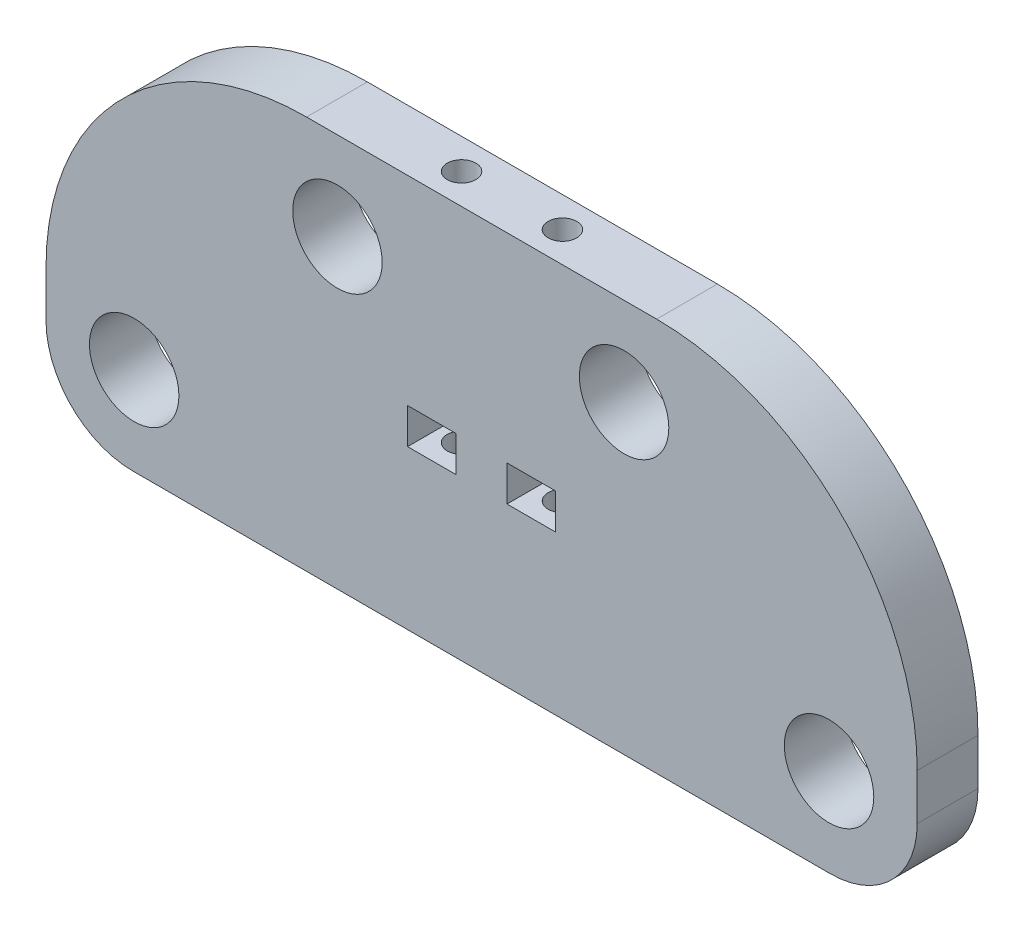
ISO-10303-21;
HEADER;
FILE_DESCRIPTION(('STEP AP214'),'2;1');
FILE_NAME('part.step','',(''),(''),'','','');
FILE_SCHEMA(('AUTOMOTIVE_DESIGN { 1 0 10303 214 1 1 1 1 }'));
ENDSEC;
DATA;
#1=APPLICATION_CONTEXT('core data for automotive mechanical design processes');
#2=APPLICATION_PROTOCOL_DEFINITION('international standard','automotive_design',2000,#1);
#3=PRODUCT_CONTEXT('',#1,'mechanical');
#4=PRODUCT('Part','Part','',(#3));
#5=PRODUCT_RELATED_PRODUCT_CATEGORY('part','',(#4));
#6=PRODUCT_DEFINITION_FORMATION('','',#4);
#7=PRODUCT_DEFINITION_CONTEXT('part definition',#1,'design');
#8=PRODUCT_DEFINITION('design','',#6,#7);
#9=PRODUCT_DEFINITION_SHAPE('','',#8);
#10=(LENGTH_UNIT() NAMED_UNIT(*) SI_UNIT(.MILLI.,.METRE.));
#11=(NAMED_UNIT(*) PLANE_ANGLE_UNIT() SI_UNIT($,.RADIAN.));
#12=(NAMED_UNIT(*) SI_UNIT($,.STERADIAN.) SOLID_ANGLE_UNIT());
#13=UNCERTAINTY_MEASURE_WITH_UNIT(LENGTH_MEASURE(1.E-05),#10,'distance_accuracy_value','');
#14=(GEOMETRIC_REPRESENTATION_CONTEXT(3) GLOBAL_UNCERTAINTY_ASSIGNED_CONTEXT((#13)) GLOBAL_UNIT_ASSIGNED_CONTEXT((#10,
#11,#12)) REPRESENTATION_CONTEXT('',''));
#15=CARTESIAN_POINT('',(0.,0.,0.));
#16=DIRECTION('',(0.,0.,1.));
#17=DIRECTION('',(1.,0.,0.));
#18=AXIS2_PLACEMENT_3D('',#15,#16,#17);
#19=CARTESIAN_POINT('',(0.,-9.2411325614042,7.));
#20=DIRECTION('',(0.,-1.,0.));
#21=DIRECTION('',(0.,0.,-1.));
#22=AXIS2_PLACEMENT_3D('',#19,#20,#21);
#23=PLANE('',#22);
#24=CARTESIAN_POINT('',(-5.72260181073988,-9.2411325614042,3.5));
#25=DIRECTION('',(0.,-1.,0.));
#26=DIRECTION('',(0.,0.,-1.));
#27=AXIS2_PLACEMENT_3D('',#24,#25,#26);
#28=CIRCLE('',#27,1.65);
#29=CARTESIAN_POINT('',(-5.72260181073988,-9.2411325614042,1.85));
#30=VERTEX_POINT('',#29);
#31=EDGE_CURVE('E410',#30,#30,#28,.T.);
#32=ORIENTED_EDGE('',*,*,#31,.F.);
#33=EDGE_LOOP('',(#32));
#34=FACE_BOUND('',#33,.T.);
#35=DIRECTION('',(-1.,0.,0.));
#36=VECTOR('',#35,1.);
#37=CARTESIAN_POINT('',(0.,-9.2411325614042,0.));
#38=LINE('',#37,#36);
#39=CARTESIAN_POINT('',(-2.83559601567761,-9.2411325614042,0.));
#40=VERTEX_POINT('',#39);
#41=CARTESIAN_POINT('',(-8.43559601567761,-9.2411325614042,0.));
#42=VERTEX_POINT('',#41);
#43=EDGE_CURVE('E263',#40,#42,#38,.T.);
#44=ORIENTED_EDGE('',*,*,#43,.F.);
#45=DIRECTION('',(0.,0.,-1.));
#46=VECTOR('',#45,1.);
#47=CARTESIAN_POINT('',(-2.83559601567761,-9.2411325614042,7.));
#48=LINE('',#47,#46);
#49=CARTESIAN_POINT('',(-2.83559601567761,-9.2411325614042,7.));
#50=VERTEX_POINT('',#49);
#51=EDGE_CURVE('E192',#50,#40,#48,.T.);
#52=ORIENTED_EDGE('',*,*,#51,.F.);
#53=DIRECTION('',(-1.,0.,0.));
#54=VECTOR('',#53,1.);
#55=CARTESIAN_POINT('',(0.,-9.2411325614042,7.));
#56=LINE('',#55,#54);
#57=CARTESIAN_POINT('',(-8.43559601567761,-9.2411325614042,7.));
#58=VERTEX_POINT('',#57);
#59=EDGE_CURVE('E392',#50,#58,#56,.T.);
#60=ORIENTED_EDGE('',*,*,#59,.T.);
#61=DIRECTION('',(0.,0.,-1.));
#62=VECTOR('',#61,1.);
#63=CARTESIAN_POINT('',(-8.43559601567761,-9.2411325614042,7.));
#64=LINE('',#63,#62);
#65=EDGE_CURVE('E180',#58,#42,#64,.T.);
#66=ORIENTED_EDGE('',*,*,#65,.T.);
#67=EDGE_LOOP('',(#44,#52,#60,#66));
#68=FACE_BOUND('',#67,.T.);
#69=ADVANCED_FACE('F40',(#34,#68),#23,.T.);
#70=CARTESIAN_POINT('',(-2.8355960156776,0.,7.));
#71=DIRECTION('',(1.,0.,0.));
#72=DIRECTION('',(0.,1.,0.));
#73=AXIS2_PLACEMENT_3D('',#70,#71,#72);
#74=PLANE('',#73);
#75=DIRECTION('',(0.,-1.,0.));
#76=VECTOR('',#75,1.);
#77=CARTESIAN_POINT('',(-2.8355960156776,0.,0.));
#78=LINE('',#77,#76);
#79=CARTESIAN_POINT('',(-2.83559601567761,-13.3411325614042,0.));
#80=VERTEX_POINT('',#79);
#81=EDGE_CURVE('E266',#40,#80,#78,.T.);
#82=ORIENTED_EDGE('',*,*,#81,.T.);
#83=DIRECTION('',(0.,0.,-1.));
#84=VECTOR('',#83,1.);
#85=CARTESIAN_POINT('',(-2.83559601567761,-13.3411325614042,7.));
#86=LINE('',#85,#84);
#87=CARTESIAN_POINT('',(-2.83559601567761,-13.3411325614042,7.));
#88=VERTEX_POINT('',#87);
#89=EDGE_CURVE('E283',#88,#80,#86,.T.);
#90=ORIENTED_EDGE('',*,*,#89,.F.);
#91=DIRECTION('',(0.,-1.,0.));
#92=VECTOR('',#91,1.);
#93=CARTESIAN_POINT('',(-2.8355960156776,0.,7.));
#94=LINE('',#93,#92);
#95=EDGE_CURVE('E395',#50,#88,#94,.T.);
#96=ORIENTED_EDGE('',*,*,#95,.F.);
#97=ORIENTED_EDGE('',*,*,#51,.T.);
#98=EDGE_LOOP('',(#82,#90,#96,#97));
#99=FACE_BOUND('',#98,.T.);
#100=ADVANCED_FACE('F325',(#99),#74,.F.);
#101=CARTESIAN_POINT('',(0.,-13.3411325614042,7.));
#102=DIRECTION('',(0.,-1.,0.));
#103=DIRECTION('',(0.,0.,-1.));
#104=AXIS2_PLACEMENT_3D('',#101,#102,#103);
#105=PLANE('',#104);
#106=CARTESIAN_POINT('',(-5.72260181073988,-13.3411325614042,3.5));
#107=DIRECTION('',(0.,-1.,0.));
#108=DIRECTION('',(0.,0.,-1.));
#109=AXIS2_PLACEMENT_3D('',#106,#107,#108);
#110=CIRCLE('',#109,1.65);
#111=CARTESIAN_POINT('',(-5.72260181073988,-13.3411325614042,1.85));
#112=VERTEX_POINT('',#111);
#113=EDGE_CURVE('E418',#112,#112,#110,.T.);
#114=ORIENTED_EDGE('',*,*,#113,.T.);
#115=EDGE_LOOP('',(#114));
#116=FACE_BOUND('',#115,.T.);
#117=DIRECTION('',(-1.,0.,0.));
#118=VECTOR('',#117,1.);
#119=CARTESIAN_POINT('',(0.,-13.3411325614042,0.));
#120=LINE('',#119,#118);
#121=CARTESIAN_POINT('',(-8.43559601567761,-13.3411325614042,0.));
#122=VERTEX_POINT('',#121);
#123=EDGE_CURVE('E269',#80,#122,#120,.T.);
#124=ORIENTED_EDGE('',*,*,#123,.T.);
#125=DIRECTION('',(0.,0.,-1.));
#126=VECTOR('',#125,1.);
#127=CARTESIAN_POINT('',(-8.43559601567761,-13.3411325614042,7.));
#128=LINE('',#127,#126);
#129=CARTESIAN_POINT('',(-8.43559601567761,-13.3411325614042,7.));
#130=VERTEX_POINT('',#129);
#131=EDGE_CURVE('E182',#130,#122,#128,.T.);
#132=ORIENTED_EDGE('',*,*,#131,.F.);
#133=DIRECTION('',(-1.,0.,0.));
#134=VECTOR('',#133,1.);
#135=CARTESIAN_POINT('',(0.,-13.3411325614042,7.));
#136=LINE('',#135,#134);
#137=EDGE_CURVE('E398',#88,#130,#136,.T.);
#138=ORIENTED_EDGE('',*,*,#137,.F.);
#139=ORIENTED_EDGE('',*,*,#89,.T.);
#140=EDGE_LOOP('',(#124,#132,#138,#139));
#141=FACE_BOUND('',#140,.T.);
#142=ADVANCED_FACE('F332',(#116,#141),#105,.F.);
#143=CARTESIAN_POINT('',(0.,-9.2411325614042,7.));
#144=DIRECTION('',(0.,1.,0.));
#145=DIRECTION('',(0.,0.,1.));
#146=AXIS2_PLACEMENT_3D('',#143,#144,#145);
#147=PLANE('',#146);
#148=CARTESIAN_POINT('',(5.89739818926012,-9.2411325614042,3.5));
#149=DIRECTION('',(0.,1.,0.));
#150=DIRECTION('',(0.,0.,1.));
#151=AXIS2_PLACEMENT_3D('',#148,#149,#150);
#152=CIRCLE('',#151,1.65);
#153=CARTESIAN_POINT('',(5.89739818926012,-9.2411325614042,5.15));
#154=VERTEX_POINT('',#153);
#155=EDGE_CURVE('E422',#154,#154,#152,.T.);
#156=ORIENTED_EDGE('',*,*,#155,.T.);
#157=EDGE_LOOP('',(#156));
#158=FACE_BOUND('',#157,.T.);
#159=DIRECTION('',(1.,0.,0.));
#160=VECTOR('',#159,1.);
#161=CARTESIAN_POINT('',(0.,-9.2411325614042,0.));
#162=LINE('',#161,#160);
#163=CARTESIAN_POINT('',(3.01039239419783,-9.2411325614042,0.));
#164=VERTEX_POINT('',#163);
#165=CARTESIAN_POINT('',(8.61039239419784,-9.2411325614042,0.));
#166=VERTEX_POINT('',#165);
#167=EDGE_CURVE('E179',#164,#166,#162,.T.);
#168=ORIENTED_EDGE('',*,*,#167,.T.);
#169=DIRECTION('',(0.,0.,-1.));
#170=VECTOR('',#169,1.);
#171=CARTESIAN_POINT('',(8.61039239419784,-9.2411325614042,7.));
#172=LINE('',#171,#170);
#173=CARTESIAN_POINT('',(8.61039239419784,-9.2411325614042,7.));
#174=VERTEX_POINT('',#173);
#175=EDGE_CURVE('E159',#174,#166,#172,.T.);
#176=ORIENTED_EDGE('',*,*,#175,.F.);
#177=DIRECTION('',(1.,0.,0.));
#178=VECTOR('',#177,1.);
#179=CARTESIAN_POINT('',(0.,-9.2411325614042,7.));
#180=LINE('',#179,#178);
#181=CARTESIAN_POINT('',(3.01039239419783,-9.2411325614042,7.));
#182=VERTEX_POINT('',#181);
#183=EDGE_CURVE('E166',#182,#174,#180,.T.);
#184=ORIENTED_EDGE('',*,*,#183,.F.);
#185=DIRECTION('',(0.,0.,-1.));
#186=VECTOR('',#185,1.);
#187=CARTESIAN_POINT('',(3.01039239419783,-9.2411325614042,7.));
#188=LINE('',#187,#186);
#189=EDGE_CURVE('E287',#182,#164,#188,.T.);
#190=ORIENTED_EDGE('',*,*,#189,.T.);
#191=EDGE_LOOP('',(#168,#176,#184,#190));
#192=FACE_BOUND('',#191,.T.);
#193=ADVANCED_FACE('F177',(#158,#192),#147,.F.);
#194=CARTESIAN_POINT('',(8.61039239419784,0.,7.));
#195=DIRECTION('',(1.,0.,0.));
#196=DIRECTION('',(0.,0.,-1.));
#197=AXIS2_PLACEMENT_3D('',#194,#195,#196);
#198=PLANE('',#197);
#199=DIRECTION('',(0.,-1.,0.));
#200=VECTOR('',#199,1.);
#201=CARTESIAN_POINT('',(8.61039239419784,0.,0.));
#202=LINE('',#201,#200);
#203=CARTESIAN_POINT('',(8.61039239419784,-13.3411325614042,0.));
#204=VERTEX_POINT('',#203);
#205=EDGE_CURVE('E255',#166,#204,#202,.T.);
#206=ORIENTED_EDGE('',*,*,#205,.T.);
#207=DIRECTION('',(0.,0.,-1.));
#208=VECTOR('',#207,1.);
#209=CARTESIAN_POINT('',(8.61039239419784,-13.3411325614042,7.));
#210=LINE('',#209,#208);
#211=CARTESIAN_POINT('',(8.61039239419784,-13.3411325614042,7.));
#212=VERTEX_POINT('',#211);
#213=EDGE_CURVE('E161',#212,#204,#210,.T.);
#214=ORIENTED_EDGE('',*,*,#213,.F.);
#215=DIRECTION('',(0.,-1.,0.));
#216=VECTOR('',#215,1.);
#217=CARTESIAN_POINT('',(8.61039239419784,0.,7.));
#218=LINE('',#217,#216);
#219=EDGE_CURVE('E154',#174,#212,#218,.T.);
#220=ORIENTED_EDGE('',*,*,#219,.F.);
#221=ORIENTED_EDGE('',*,*,#175,.T.);
#222=EDGE_LOOP('',(#206,#214,#220,#221));
#223=FACE_BOUND('',#222,.T.);
#224=ADVANCED_FACE('F157',(#223),#198,.F.);
#225=CARTESIAN_POINT('',(0.,-13.3411325614042,7.));
#226=DIRECTION('',(0.,1.,0.));
#227=DIRECTION('',(0.,0.,1.));
#228=AXIS2_PLACEMENT_3D('',#225,#226,#227);
#229=PLANE('',#228);
#230=CARTESIAN_POINT('',(5.89739818926012,-13.3411325614042,3.5));
#231=DIRECTION('',(0.,1.,0.));
#232=DIRECTION('',(0.,0.,1.));
#233=AXIS2_PLACEMENT_3D('',#230,#231,#232);
#234=CIRCLE('',#233,1.65);
#235=CARTESIAN_POINT('',(5.89739818926012,-13.3411325614042,5.15));
#236=VERTEX_POINT('',#235);
#237=EDGE_CURVE('E433',#236,#236,#234,.T.);
#238=ORIENTED_EDGE('',*,*,#237,.F.);
#239=EDGE_LOOP('',(#238));
#240=FACE_BOUND('',#239,.T.);
#241=DIRECTION('',(1.,0.,0.));
#242=VECTOR('',#241,1.);
#243=CARTESIAN_POINT('',(0.,-13.3411325614042,0.));
#244=LINE('',#243,#242);
#245=CARTESIAN_POINT('',(3.01039239419784,-13.3411325614042,0.));
#246=VERTEX_POINT('',#245);
#247=EDGE_CURVE('E257',#246,#204,#244,.T.);
#248=ORIENTED_EDGE('',*,*,#247,.F.);
#249=DIRECTION('',(0.,0.,-1.));
#250=VECTOR('',#249,1.);
#251=CARTESIAN_POINT('',(3.01039239419784,-13.3411325614042,7.));
#252=LINE('',#251,#250);
#253=CARTESIAN_POINT('',(3.01039239419784,-13.3411325614042,7.));
#254=VERTEX_POINT('',#253);
#255=EDGE_CURVE('E184',#254,#246,#252,.T.);
#256=ORIENTED_EDGE('',*,*,#255,.F.);
#257=DIRECTION('',(1.,0.,0.));
#258=VECTOR('',#257,1.);
#259=CARTESIAN_POINT('',(0.,-13.3411325614042,7.));
#260=LINE('',#259,#258);
#261=EDGE_CURVE('E165',#254,#212,#260,.T.);
#262=ORIENTED_EDGE('',*,*,#261,.T.);
#263=ORIENTED_EDGE('',*,*,#213,.T.);
#264=EDGE_LOOP('',(#248,#256,#262,#263));
#265=FACE_BOUND('',#264,.T.);
#266=ADVANCED_FACE('F294',(#240,#265),#229,.T.);
#267=CARTESIAN_POINT('',(50.2373981892601,0.,7.));
#268=DIRECTION('',(1.,0.,0.));
#269=DIRECTION('',(0.,0.,-1.));
#270=AXIS2_PLACEMENT_3D('',#267,#268,#269);
#271=PLANE('',#270);
#272=DIRECTION('',(0.,-1.,0.));
#273=VECTOR('',#272,1.);
#274=CARTESIAN_POINT('',(50.2373981892601,0.,0.));
#275=LINE('',#274,#273);
#276=CARTESIAN_POINT('',(50.2373981892601,-16.2911325614042,0.));
#277=VERTEX_POINT('',#276);
#278=CARTESIAN_POINT('',(50.2373981892601,-21.5911325614042,0.));
#279=VERTEX_POINT('',#278);
#280=EDGE_CURVE('E244',#277,#279,#275,.T.);
#281=ORIENTED_EDGE('',*,*,#280,.F.);
#282=DIRECTION('',(0.,0.,-1.));
#283=VECTOR('',#282,1.);
#284=CARTESIAN_POINT('',(50.2373981892601,-16.2911325614042,7.));
#285=LINE('',#284,#283);
#286=CARTESIAN_POINT('',(50.2373981892601,-16.2911325614042,7.));
#287=VERTEX_POINT('',#286);
#288=EDGE_CURVE('E11',#277,#287,#285,.F.);
#289=ORIENTED_EDGE('',*,*,#288,.T.);
#290=DIRECTION('',(0.,-1.,0.));
#291=VECTOR('',#290,1.);
#292=CARTESIAN_POINT('',(50.2373981892601,0.,7.));
#293=LINE('',#292,#291);
#294=CARTESIAN_POINT('',(50.2373981892601,-21.5911325614042,7.));
#295=VERTEX_POINT('',#294);
#296=EDGE_CURVE('E382',#287,#295,#293,.T.);
#297=ORIENTED_EDGE('',*,*,#296,.T.);
#298=DIRECTION('',(0.,0.,-1.));
#299=VECTOR('',#298,1.);
#300=CARTESIAN_POINT('',(50.2373981892601,-21.5911325614042,0.));
#301=LINE('',#300,#299);
#302=EDGE_CURVE('E188',#295,#279,#301,.T.);
#303=ORIENTED_EDGE('',*,*,#302,.T.);
#304=EDGE_LOOP('',(#281,#289,#297,#303));
#305=FACE_BOUND('',#304,.T.);
#306=ADVANCED_FACE('F345',(#305),#271,.T.);
#307=CARTESIAN_POINT('',(0.,13.7088674385958,7.));
#308=DIRECTION('',(0.,-1.,0.));
#309=DIRECTION('',(1.,0.,0.));
#310=AXIS2_PLACEMENT_3D('',#307,#308,#309);
#311=PLANE('',#310);
#312=CARTESIAN_POINT('',(-5.72260181073988,13.7088674385958,3.5));
#313=DIRECTION('',(0.,1.,0.));
#314=DIRECTION('',(-1.,0.,0.));
#315=AXIS2_PLACEMENT_3D('',#312,#313,#314);
#316=CIRCLE('',#315,1.65);
#317=CARTESIAN_POINT('',(-7.37260181073988,13.7088674385958,3.5));
#318=VERTEX_POINT('',#317);
#319=EDGE_CURVE('E443',#318,#318,#316,.T.);
#320=ORIENTED_EDGE('',*,*,#319,.F.);
#321=EDGE_LOOP('',(#320));
#322=FACE_BOUND('',#321,.T.);
#323=CARTESIAN_POINT('',(5.89739818926011,13.7088674385958,3.5));
#324=DIRECTION('',(0.,1.,0.));
#325=DIRECTION('',(1.,0.,0.));
#326=AXIS2_PLACEMENT_3D('',#323,#324,#325);
#327=CIRCLE('',#326,1.65);
#328=CARTESIAN_POINT('',(7.54739818926011,13.7088674385958,3.5));
#329=VERTEX_POINT('',#328);
#330=EDGE_CURVE('E440',#329,#329,#327,.T.);
#331=ORIENTED_EDGE('',*,*,#330,.F.);
#332=EDGE_LOOP('',(#331));
#333=FACE_BOUND('',#332,.T.);
#334=DIRECTION('',(-1.,0.,0.));
#335=VECTOR('',#334,1.);
#336=CARTESIAN_POINT('',(0.,13.7088674385958,0.));
#337=LINE('',#336,#335);
#338=CARTESIAN_POINT('',(20.2373981892601,13.7088674385958,0.));
#339=VERTEX_POINT('',#338);
#340=CARTESIAN_POINT('',(-20.0626018107399,13.7088674385958,0.));
#341=VERTEX_POINT('',#340);
#342=EDGE_CURVE('E240',#339,#341,#337,.T.);
#343=ORIENTED_EDGE('',*,*,#342,.T.);
#344=DIRECTION('',(0.,0.,-1.));
#345=VECTOR('',#344,1.);
#346=CARTESIAN_POINT('',(-20.0626018107399,13.7088674385958,7.));
#347=LINE('',#346,#345);
#348=CARTESIAN_POINT('',(-20.0626018107399,13.7088674385958,7.));
#349=VERTEX_POINT('',#348);
#350=EDGE_CURVE('E61',#341,#349,#347,.F.);
#351=ORIENTED_EDGE('',*,*,#350,.T.);
#352=DIRECTION('',(-1.,0.,0.));
#353=VECTOR('',#352,1.);
#354=CARTESIAN_POINT('',(0.,13.7088674385958,7.));
#355=LINE('',#354,#353);
#356=CARTESIAN_POINT('',(20.2373981892601,13.7088674385958,7.));
#357=VERTEX_POINT('',#356);
#358=EDGE_CURVE('E226',#357,#349,#355,.T.);
#359=ORIENTED_EDGE('',*,*,#358,.F.);
#360=DIRECTION('',(0.,0.,-1.));
#361=VECTOR('',#360,1.);
#362=CARTESIAN_POINT('',(20.2373981892601,13.7088674385958,0.));
#363=LINE('',#362,#361);
#364=EDGE_CURVE('E217',#357,#339,#363,.T.);
#365=ORIENTED_EDGE('',*,*,#364,.T.);
#366=EDGE_LOOP('',(#343,#351,#359,#365));
#367=FACE_BOUND('',#366,.T.);
#368=ADVANCED_FACE('F242',(#322,#333,#367),#311,.F.);
#369=CARTESIAN_POINT('',(-50.0626018107399,0.,7.));
#370=DIRECTION('',(1.,0.,0.));
#371=DIRECTION('',(0.,0.,-1.));
#372=AXIS2_PLACEMENT_3D('',#369,#370,#371);
#373=PLANE('',#372);
#374=DIRECTION('',(0.,-1.,0.));
#375=VECTOR('',#374,1.);
#376=CARTESIAN_POINT('',(-50.0626018107399,0.,7.));
#377=LINE('',#376,#375);
#378=CARTESIAN_POINT('',(-50.0626018107399,-16.2911325614042,7.));
#379=VERTEX_POINT('',#378);
#380=CARTESIAN_POINT('',(-50.0626018107399,-21.5911325614042,7.));
#381=VERTEX_POINT('',#380);
#382=EDGE_CURVE('E225',#379,#381,#377,.T.);
#383=ORIENTED_EDGE('',*,*,#382,.F.);
#384=DIRECTION('',(0.,0.,-1.));
#385=VECTOR('',#384,1.);
#386=CARTESIAN_POINT('',(-50.0626018107399,-16.2911325614042,7.));
#387=LINE('',#386,#385);
#388=CARTESIAN_POINT('',(-50.0626018107399,-16.2911325614042,0.));
#389=VERTEX_POINT('',#388);
#390=EDGE_CURVE('E210',#379,#389,#387,.T.);
#391=ORIENTED_EDGE('',*,*,#390,.T.);
#392=DIRECTION('',(0.,-1.,0.));
#393=VECTOR('',#392,1.);
#394=CARTESIAN_POINT('',(-50.0626018107399,0.,0.));
#395=LINE('',#394,#393);
#396=CARTESIAN_POINT('',(-50.0626018107399,-21.5911325614042,0.));
#397=VERTEX_POINT('',#396);
#398=EDGE_CURVE('E241',#389,#397,#395,.T.);
#399=ORIENTED_EDGE('',*,*,#398,.T.);
#400=DIRECTION('',(0.,0.,-1.));
#401=VECTOR('',#400,1.);
#402=CARTESIAN_POINT('',(-50.0626018107399,-21.5911325614042,7.));
#403=LINE('',#402,#401);
#404=EDGE_CURVE('E207',#397,#381,#403,.F.);
#405=ORIENTED_EDGE('',*,*,#404,.T.);
#406=EDGE_LOOP('',(#383,#391,#399,#405));
#407=FACE_BOUND('',#406,.T.);
#408=ADVANCED_FACE('F230',(#407),#373,.F.);
#409=CARTESIAN_POINT('',(-39.9126018107399,-21.4411325614042,7.));
#410=DIRECTION('',(0.,0.,-1.));
#411=DIRECTION('',(-1.,0.,0.));
#412=AXIS2_PLACEMENT_3D('',#409,#410,#411);
#413=CYLINDRICAL_SURFACE('',#412,5.15);
#414=CARTESIAN_POINT('',(-39.9126018107399,-21.4411325614042,7.));
#415=DIRECTION('',(0.,0.,1.));
#416=DIRECTION('',(1.,0.,0.));
#417=AXIS2_PLACEMENT_3D('',#414,#415,#416);
#418=CIRCLE('',#417,5.15);
#419=CARTESIAN_POINT('',(-34.7626018107399,-21.4411325614042,7.));
#420=VERTEX_POINT('',#419);
#421=EDGE_CURVE('E403',#420,#420,#418,.T.);
#422=ORIENTED_EDGE('',*,*,#421,.T.);
#423=EDGE_LOOP('',(#422));
#424=FACE_BOUND('',#423,.T.);
#425=CARTESIAN_POINT('',(-39.9126018107399,-21.4411325614042,0.));
#426=DIRECTION('',(0.,0.,1.));
#427=DIRECTION('',(1.,0.,0.));
#428=AXIS2_PLACEMENT_3D('',#425,#426,#427);
#429=CIRCLE('',#428,5.15);
#430=CARTESIAN_POINT('',(-34.7626018107399,-21.4411325614042,0.));
#431=VERTEX_POINT('',#430);
#432=EDGE_CURVE('E275',#431,#431,#429,.T.);
#433=ORIENTED_EDGE('',*,*,#432,.F.);
#434=EDGE_LOOP('',(#433));
#435=FACE_BOUND('',#434,.T.);
#436=ADVANCED_FACE('F357',(#424,#435),#413,.F.);
#437=CARTESIAN_POINT('',(-8.43559601567761,0.,7.));
#438=DIRECTION('',(1.,0.,0.));
#439=DIRECTION('',(0.,0.,-1.));
#440=AXIS2_PLACEMENT_3D('',#437,#438,#439);
#441=PLANE('',#440);
#442=DIRECTION('',(0.,-1.,0.));
#443=VECTOR('',#442,1.);
#444=CARTESIAN_POINT('',(-8.43559601567761,0.,0.));
#445=LINE('',#444,#443);
#446=EDGE_CURVE('E272',#42,#122,#445,.T.);
#447=ORIENTED_EDGE('',*,*,#446,.F.);
#448=ORIENTED_EDGE('',*,*,#65,.F.);
#449=DIRECTION('',(0.,-1.,0.));
#450=VECTOR('',#449,1.);
#451=CARTESIAN_POINT('',(-8.43559601567761,0.,7.));
#452=LINE('',#451,#450);
#453=EDGE_CURVE('E400',#58,#130,#452,.T.);
#454=ORIENTED_EDGE('',*,*,#453,.T.);
#455=ORIENTED_EDGE('',*,*,#131,.T.);
#456=EDGE_LOOP('',(#447,#448,#454,#455));
#457=FACE_BOUND('',#456,.T.);
#458=ADVANCED_FACE('F342',(#457),#441,.T.);
#459=CARTESIAN_POINT('',(3.01039239419783,0.,7.));
#460=DIRECTION('',(1.,0.,0.));
#461=DIRECTION('',(0.,1.,0.));
#462=AXIS2_PLACEMENT_3D('',#459,#460,#461);
#463=PLANE('',#462);
#464=DIRECTION('',(0.,-1.,0.));
#465=VECTOR('',#464,1.);
#466=CARTESIAN_POINT('',(3.01039239419783,0.,0.));
#467=LINE('',#466,#465);
#468=EDGE_CURVE('E260',#164,#246,#467,.T.);
#469=ORIENTED_EDGE('',*,*,#468,.F.);
#470=ORIENTED_EDGE('',*,*,#189,.F.);
#471=DIRECTION('',(0.,-1.,0.));
#472=VECTOR('',#471,1.);
#473=CARTESIAN_POINT('',(3.01039239419783,0.,7.));
#474=LINE('',#473,#472);
#475=EDGE_CURVE('E173',#182,#254,#474,.T.);
#476=ORIENTED_EDGE('',*,*,#475,.T.);
#477=ORIENTED_EDGE('',*,*,#255,.T.);
#478=EDGE_LOOP('',(#469,#470,#476,#477));
#479=FACE_BOUND('',#478,.T.);
#480=ADVANCED_FACE('F292',(#479),#463,.T.);
#481=CARTESIAN_POINT('',(0.,-31.5911325614042,7.));
#482=DIRECTION('',(0.,1.,0.));
#483=DIRECTION('',(0.,0.,1.));
#484=AXIS2_PLACEMENT_3D('',#481,#482,#483);
#485=PLANE('',#484);
#486=DIRECTION('',(1.,0.,0.));
#487=VECTOR('',#486,1.);
#488=CARTESIAN_POINT('',(0.,-31.5911325614042,0.));
#489=LINE('',#488,#487);
#490=CARTESIAN_POINT('',(-40.0626018107399,-31.5911325614042,0.));
#491=VERTEX_POINT('',#490);
#492=CARTESIAN_POINT('',(40.2373981892601,-31.5911325614042,0.));
#493=VERTEX_POINT('',#492);
#494=EDGE_CURVE('E246',#491,#493,#489,.T.);
#495=ORIENTED_EDGE('',*,*,#494,.T.);
#496=DIRECTION('',(0.,0.,-1.));
#497=VECTOR('',#496,1.);
#498=CARTESIAN_POINT('',(40.2373981892601,-31.5911325614042,7.));
#499=LINE('',#498,#497);
#500=CARTESIAN_POINT('',(40.2373981892601,-31.5911325614042,7.));
#501=VERTEX_POINT('',#500);
#502=EDGE_CURVE('E200',#493,#501,#499,.F.);
#503=ORIENTED_EDGE('',*,*,#502,.T.);
#504=DIRECTION('',(1.,0.,0.));
#505=VECTOR('',#504,1.);
#506=CARTESIAN_POINT('',(0.,-31.5911325614042,7.));
#507=LINE('',#506,#505);
#508=CARTESIAN_POINT('',(-40.0626018107399,-31.5911325614042,7.));
#509=VERTEX_POINT('',#508);
#510=EDGE_CURVE('E175',#509,#501,#507,.T.);
#511=ORIENTED_EDGE('',*,*,#510,.F.);
#512=DIRECTION('',(0.,0.,-1.));
#513=VECTOR('',#512,1.);
#514=CARTESIAN_POINT('',(-40.0626018107399,-31.5911325614042,7.));
#515=LINE('',#514,#513);
#516=EDGE_CURVE('E197',#509,#491,#515,.T.);
#517=ORIENTED_EDGE('',*,*,#516,.T.);
#518=EDGE_LOOP('',(#495,#503,#511,#517));
#519=FACE_BOUND('',#518,.T.);
#520=ADVANCED_FACE('F341',(#519),#485,.F.);
#521=CARTESIAN_POINT('',(-16.5085902206154,3.55886743859581,7.));
#522=DIRECTION('',(0.,0.,-1.));
#523=DIRECTION('',(-1.,0.,0.));
#524=AXIS2_PLACEMENT_3D('',#521,#522,#523);
#525=CYLINDRICAL_SURFACE('',#524,5.15);
#526=CARTESIAN_POINT('',(-16.5085902206154,3.55886743859581,7.));
#527=DIRECTION('',(0.,0.,1.));
#528=DIRECTION('',(1.,0.,0.));
#529=AXIS2_PLACEMENT_3D('',#526,#527,#528);
#530=CIRCLE('',#529,5.15);
#531=CARTESIAN_POINT('',(-11.3585902206154,3.55886743859581,7.));
#532=VERTEX_POINT('',#531);
#533=EDGE_CURVE('E384',#532,#532,#530,.T.);
#534=ORIENTED_EDGE('',*,*,#533,.T.);
#535=EDGE_LOOP('',(#534));
#536=FACE_BOUND('',#535,.T.);
#537=CARTESIAN_POINT('',(-16.5085902206154,3.55886743859581,0.));
#538=DIRECTION('',(0.,0.,1.));
#539=DIRECTION('',(1.,0.,0.));
#540=AXIS2_PLACEMENT_3D('',#537,#538,#539);
#541=CIRCLE('',#540,5.15);
#542=CARTESIAN_POINT('',(-11.3585902206154,3.55886743859581,0.));
#543=VERTEX_POINT('',#542);
#544=EDGE_CURVE('E248',#543,#543,#541,.T.);
#545=ORIENTED_EDGE('',*,*,#544,.F.);
#546=EDGE_LOOP('',(#545));
#547=FACE_BOUND('',#546,.T.);
#548=ADVANCED_FACE('F320',(#536,#547),#525,.F.);
#549=CARTESIAN_POINT('',(16.4914097793846,3.55886743859581,7.));
#550=DIRECTION('',(0.,0.,-1.));
#551=DIRECTION('',(-1.,0.,0.));
#552=AXIS2_PLACEMENT_3D('',#549,#550,#551);
#553=CYLINDRICAL_SURFACE('',#552,5.15);
#554=CARTESIAN_POINT('',(16.4914097793846,3.55886743859581,7.));
#555=DIRECTION('',(0.,0.,1.));
#556=DIRECTION('',(1.,0.,0.));
#557=AXIS2_PLACEMENT_3D('',#554,#555,#556);
#558=CIRCLE('',#557,5.15);
#559=CARTESIAN_POINT('',(21.6414097793846,3.55886743859581,7.));
#560=VERTEX_POINT('',#559);
#561=EDGE_CURVE('E280',#560,#560,#558,.F.);
#562=ORIENTED_EDGE('',*,*,#561,.F.);
#563=EDGE_LOOP('',(#562));
#564=FACE_BOUND('',#563,.T.);
#565=CARTESIAN_POINT('',(16.4914097793846,3.55886743859581,0.));
#566=DIRECTION('',(0.,0.,1.));
#567=DIRECTION('',(1.,0.,0.));
#568=AXIS2_PLACEMENT_3D('',#565,#566,#567);
#569=CIRCLE('',#568,5.15);
#570=CARTESIAN_POINT('',(21.6414097793846,3.55886743859581,0.));
#571=VERTEX_POINT('',#570);
#572=EDGE_CURVE('E408',#571,#571,#569,.F.);
#573=ORIENTED_EDGE('',*,*,#572,.T.);
#574=EDGE_LOOP('',(#573));
#575=FACE_BOUND('',#574,.T.);
#576=ADVANCED_FACE('F310',(#564,#575),#553,.F.);
#577=CARTESIAN_POINT('',(40.0873981892601,-21.4411325614042,7.));
#578=DIRECTION('',(0.,0.,-1.));
#579=DIRECTION('',(-1.,0.,0.));
#580=AXIS2_PLACEMENT_3D('',#577,#578,#579);
#581=CYLINDRICAL_SURFACE('',#580,5.15);
#582=CARTESIAN_POINT('',(40.0873981892601,-21.4411325614042,7.));
#583=DIRECTION('',(0.,0.,1.));
#584=DIRECTION('',(1.,0.,0.));
#585=AXIS2_PLACEMENT_3D('',#582,#583,#584);
#586=CIRCLE('',#585,5.15);
#587=CARTESIAN_POINT('',(45.2373981892601,-21.4411325614042,7.));
#588=VERTEX_POINT('',#587);
#589=EDGE_CURVE('E288',#588,#588,#586,.F.);
#590=ORIENTED_EDGE('',*,*,#589,.F.);
#591=EDGE_LOOP('',(#590));
#592=FACE_BOUND('',#591,.T.);
#593=CARTESIAN_POINT('',(40.0873981892601,-21.4411325614042,0.));
#594=DIRECTION('',(0.,0.,1.));
#595=DIRECTION('',(1.,0.,0.));
#596=AXIS2_PLACEMENT_3D('',#593,#594,#595);
#597=CIRCLE('',#596,5.15);
#598=CARTESIAN_POINT('',(45.2373981892601,-21.4411325614042,0.));
#599=VERTEX_POINT('',#598);
#600=EDGE_CURVE('E278',#599,#599,#597,.F.);
#601=ORIENTED_EDGE('',*,*,#600,.T.);
#602=EDGE_LOOP('',(#601));
#603=FACE_BOUND('',#602,.T.);
#604=ADVANCED_FACE('F308',(#592,#603),#581,.F.);
#605=CARTESIAN_POINT('',(0.,0.,7.));
#606=DIRECTION('',(0.,0.,1.));
#607=DIRECTION('',(1.,0.,0.));
#608=AXIS2_PLACEMENT_3D('',#605,#606,#607);
#609=PLANE('',#608);
#610=ORIENTED_EDGE('',*,*,#561,.T.);
#611=EDGE_LOOP('',(#610));
#612=FACE_BOUND('',#611,.T.);
#613=ORIENTED_EDGE('',*,*,#533,.F.);
#614=EDGE_LOOP('',(#613));
#615=FACE_BOUND('',#614,.T.);
#616=ORIENTED_EDGE('',*,*,#358,.T.);
#617=CARTESIAN_POINT('',(-20.0626018107399,-16.2911325614042,7.));
#618=DIRECTION('',(0.,0.,1.));
#619=DIRECTION('',(1.,0.,0.));
#620=AXIS2_PLACEMENT_3D('',#617,#618,#619);
#621=CIRCLE('',#620,30.);
#622=EDGE_CURVE('E48',#349,#379,#621,.T.);
#623=ORIENTED_EDGE('',*,*,#622,.T.);
#624=ORIENTED_EDGE('',*,*,#382,.T.);
#625=CARTESIAN_POINT('',(-40.0626018107399,-21.5911325614042,7.));
#626=DIRECTION('',(0.,0.,1.));
#627=DIRECTION('',(1.,0.,0.));
#628=AXIS2_PLACEMENT_3D('',#625,#626,#627);
#629=CIRCLE('',#628,10.);
#630=EDGE_CURVE('E202',#381,#509,#629,.T.);
#631=ORIENTED_EDGE('',*,*,#630,.T.);
#632=ORIENTED_EDGE('',*,*,#510,.T.);
#633=CARTESIAN_POINT('',(40.2373981892601,-21.5911325614042,7.));
#634=DIRECTION('',(0.,0.,1.));
#635=DIRECTION('',(1.,0.,0.));
#636=AXIS2_PLACEMENT_3D('',#633,#634,#635);
#637=CIRCLE('',#636,10.);
#638=EDGE_CURVE('E204',#501,#295,#637,.T.);
#639=ORIENTED_EDGE('',*,*,#638,.T.);
#640=ORIENTED_EDGE('',*,*,#296,.F.);
#641=CARTESIAN_POINT('',(20.2373981892601,-16.2911325614042,7.));
#642=DIRECTION('',(0.,0.,1.));
#643=DIRECTION('',(1.,0.,0.));
#644=AXIS2_PLACEMENT_3D('',#641,#642,#643);
#645=CIRCLE('',#644,30.);
#646=EDGE_CURVE('E221',#287,#357,#645,.T.);
#647=ORIENTED_EDGE('',*,*,#646,.T.);
#648=EDGE_LOOP('',(#616,#623,#624,#631,#632,#639,#640,#647));
#649=FACE_BOUND('',#648,.T.);
#650=ORIENTED_EDGE('',*,*,#183,.T.);
#651=ORIENTED_EDGE('',*,*,#219,.T.);
#652=ORIENTED_EDGE('',*,*,#261,.F.);
#653=ORIENTED_EDGE('',*,*,#475,.F.);
#654=EDGE_LOOP('',(#650,#651,#652,#653));
#655=FACE_BOUND('',#654,.T.);
#656=ORIENTED_EDGE('',*,*,#59,.F.);
#657=ORIENTED_EDGE('',*,*,#95,.T.);
#658=ORIENTED_EDGE('',*,*,#137,.T.);
#659=ORIENTED_EDGE('',*,*,#453,.F.);
#660=EDGE_LOOP('',(#656,#657,#658,#659));
#661=FACE_BOUND('',#660,.T.);
#662=ORIENTED_EDGE('',*,*,#421,.F.);
#663=EDGE_LOOP('',(#662));
#664=FACE_BOUND('',#663,.T.);
#665=ORIENTED_EDGE('',*,*,#589,.T.);
#666=EDGE_LOOP('',(#665));
#667=FACE_BOUND('',#666,.T.);
#668=ADVANCED_FACE('F170',(#612,#615,#649,#655,#661,#664,#667),#609,.T.);
#669=CARTESIAN_POINT('',(0.,0.,0.));
#670=DIRECTION('',(0.,0.,1.));
#671=DIRECTION('',(1.,0.,0.));
#672=AXIS2_PLACEMENT_3D('',#669,#670,#671);
#673=PLANE('',#672);
#674=ORIENTED_EDGE('',*,*,#572,.F.);
#675=EDGE_LOOP('',(#674));
#676=FACE_BOUND('',#675,.T.);
#677=ORIENTED_EDGE('',*,*,#544,.T.);
#678=EDGE_LOOP('',(#677));
#679=FACE_BOUND('',#678,.T.);
#680=ORIENTED_EDGE('',*,*,#398,.F.);
#681=CARTESIAN_POINT('',(-20.0626018107399,-16.2911325614042,0.));
#682=DIRECTION('',(0.,0.,1.));
#683=DIRECTION('',(1.,0.,0.));
#684=AXIS2_PLACEMENT_3D('',#681,#682,#683);
#685=CIRCLE('',#684,30.);
#686=EDGE_CURVE('E215',#389,#341,#685,.F.);
#687=ORIENTED_EDGE('',*,*,#686,.T.);
#688=ORIENTED_EDGE('',*,*,#342,.F.);
#689=CARTESIAN_POINT('',(20.2373981892601,-16.2911325614042,0.));
#690=DIRECTION('',(0.,0.,1.));
#691=DIRECTION('',(1.,0.,0.));
#692=AXIS2_PLACEMENT_3D('',#689,#690,#691);
#693=CIRCLE('',#692,30.);
#694=EDGE_CURVE('E213',#339,#277,#693,.F.);
#695=ORIENTED_EDGE('',*,*,#694,.T.);
#696=ORIENTED_EDGE('',*,*,#280,.T.);
#697=CARTESIAN_POINT('',(40.2373981892601,-21.5911325614042,0.));
#698=DIRECTION('',(0.,0.,1.));
#699=DIRECTION('',(1.,0.,0.));
#700=AXIS2_PLACEMENT_3D('',#697,#698,#699);
#701=CIRCLE('',#700,10.);
#702=EDGE_CURVE('E195',#279,#493,#701,.F.);
#703=ORIENTED_EDGE('',*,*,#702,.T.);
#704=ORIENTED_EDGE('',*,*,#494,.F.);
#705=CARTESIAN_POINT('',(-40.0626018107399,-21.5911325614042,0.));
#706=DIRECTION('',(0.,0.,1.));
#707=DIRECTION('',(1.,0.,0.));
#708=AXIS2_PLACEMENT_3D('',#705,#706,#707);
#709=CIRCLE('',#708,10.);
#710=EDGE_CURVE('E191',#491,#397,#709,.F.);
#711=ORIENTED_EDGE('',*,*,#710,.T.);
#712=EDGE_LOOP('',(#680,#687,#688,#695,#696,#703,#704,#711));
#713=FACE_BOUND('',#712,.T.);
#714=ORIENTED_EDGE('',*,*,#167,.F.);
#715=ORIENTED_EDGE('',*,*,#468,.T.);
#716=ORIENTED_EDGE('',*,*,#247,.T.);
#717=ORIENTED_EDGE('',*,*,#205,.F.);
#718=EDGE_LOOP('',(#714,#715,#716,#717));
#719=FACE_BOUND('',#718,.T.);
#720=ORIENTED_EDGE('',*,*,#43,.T.);
#721=ORIENTED_EDGE('',*,*,#446,.T.);
#722=ORIENTED_EDGE('',*,*,#123,.F.);
#723=ORIENTED_EDGE('',*,*,#81,.F.);
#724=EDGE_LOOP('',(#720,#721,#722,#723));
#725=FACE_BOUND('',#724,.T.);
#726=ORIENTED_EDGE('',*,*,#432,.T.);
#727=EDGE_LOOP('',(#726));
#728=FACE_BOUND('',#727,.T.);
#729=ORIENTED_EDGE('',*,*,#600,.F.);
#730=EDGE_LOOP('',(#729));
#731=FACE_BOUND('',#730,.T.);
#732=ADVANCED_FACE('F238',(#676,#679,#713,#719,#725,#728,#731),#673,.F.);
#733=CARTESIAN_POINT('',(5.89739818926012,-21.2911325614042,3.5));
#734=DIRECTION('',(0.,1.,0.));
#735=DIRECTION('',(-1.,0.,0.));
#736=AXIS2_PLACEMENT_3D('',#733,#734,#735);
#737=CYLINDRICAL_SURFACE('',#736,1.65);
#738=ORIENTED_EDGE('',*,*,#330,.T.);
#739=EDGE_LOOP('',(#738));
#740=FACE_BOUND('',#739,.T.);
#741=ORIENTED_EDGE('',*,*,#155,.F.);
#742=EDGE_LOOP('',(#741));
#743=FACE_BOUND('',#742,.T.);
#744=ADVANCED_FACE('F297',(#740,#743),#737,.F.);
#745=CARTESIAN_POINT('',(-5.72260181073988,-21.2911325614042,3.5));
#746=DIRECTION('',(0.,1.,0.));
#747=DIRECTION('',(-1.,0.,0.));
#748=AXIS2_PLACEMENT_3D('',#745,#746,#747);
#749=CYLINDRICAL_SURFACE('',#748,1.65);
#750=ORIENTED_EDGE('',*,*,#31,.T.);
#751=EDGE_LOOP('',(#750));
#752=FACE_BOUND('',#751,.T.);
#753=ORIENTED_EDGE('',*,*,#319,.T.);
#754=EDGE_LOOP('',(#753));
#755=FACE_BOUND('',#754,.T.);
#756=ADVANCED_FACE('F455',(#752,#755),#749,.F.);
#757=ORIENTED_EDGE('',*,*,#237,.T.);
#758=EDGE_LOOP('',(#757));
#759=FACE_BOUND('',#758,.T.);
#760=CARTESIAN_POINT('',(5.89739818926012,-21.2911325614042,3.5));
#761=DIRECTION('',(0.,1.,0.));
#762=DIRECTION('',(1.,0.,0.));
#763=AXIS2_PLACEMENT_3D('',#760,#761,#762);
#764=CIRCLE('',#763,1.65);
#765=CARTESIAN_POINT('',(7.54739818926012,-21.2911325614042,3.5));
#766=VERTEX_POINT('',#765);
#767=EDGE_CURVE('E437',#766,#766,#764,.T.);
#768=ORIENTED_EDGE('',*,*,#767,.F.);
#769=EDGE_LOOP('',(#768));
#770=FACE_BOUND('',#769,.T.);
#771=ADVANCED_FACE('F521',(#759,#770),#737,.F.);
#772=CARTESIAN_POINT('',(5.89739818926012,-21.2911325614042,3.5));
#773=DIRECTION('',(0.,-1.,0.));
#774=DIRECTION('',(1.,0.,0.));
#775=AXIS2_PLACEMENT_3D('',#772,#773,#774);
#776=PLANE('',#775);
#777=ORIENTED_EDGE('',*,*,#767,.T.);
#778=EDGE_LOOP('',(#777));
#779=FACE_BOUND('',#778,.T.);
#780=ADVANCED_FACE('F453',(#779),#776,.F.);
#781=CARTESIAN_POINT('',(-5.72260181073988,-21.2911325614042,3.5));
#782=DIRECTION('',(0.,1.,0.));
#783=DIRECTION('',(-1.,0.,0.));
#784=AXIS2_PLACEMENT_3D('',#781,#782,#783);
#785=CIRCLE('',#784,1.65);
#786=CARTESIAN_POINT('',(-7.37260181073988,-21.2911325614042,3.5));
#787=VERTEX_POINT('',#786);
#788=EDGE_CURVE('E436',#787,#787,#785,.T.);
#789=ORIENTED_EDGE('',*,*,#788,.F.);
#790=EDGE_LOOP('',(#789));
#791=FACE_BOUND('',#790,.T.);
#792=ORIENTED_EDGE('',*,*,#113,.F.);
#793=EDGE_LOOP('',(#792));
#794=FACE_BOUND('',#793,.T.);
#795=ADVANCED_FACE('F450',(#791,#794),#749,.F.);
#796=CARTESIAN_POINT('',(-5.72260181073988,-21.2911325614042,3.5));
#797=DIRECTION('',(0.,1.,0.));
#798=DIRECTION('',(-1.,0.,0.));
#799=AXIS2_PLACEMENT_3D('',#796,#797,#798);
#800=PLANE('',#799);
#801=ORIENTED_EDGE('',*,*,#788,.T.);
#802=EDGE_LOOP('',(#801));
#803=FACE_BOUND('',#802,.T.);
#804=ADVANCED_FACE('F370',(#803),#800,.T.);
#805=CARTESIAN_POINT('',(40.2373981892601,-21.5911325614042,7.));
#806=DIRECTION('',(0.,0.,1.));
#807=DIRECTION('',(1.,0.,0.));
#808=AXIS2_PLACEMENT_3D('',#805,#806,#807);
#809=CYLINDRICAL_SURFACE('',#808,10.);
#810=ORIENTED_EDGE('',*,*,#638,.F.);
#811=ORIENTED_EDGE('',*,*,#502,.F.);
#812=ORIENTED_EDGE('',*,*,#702,.F.);
#813=ORIENTED_EDGE('',*,*,#302,.F.);
#814=EDGE_LOOP('',(#810,#811,#812,#813));
#815=FACE_BOUND('',#814,.T.);
#816=ADVANCED_FACE('F366',(#815),#809,.T.);
#817=CARTESIAN_POINT('',(-40.0626018107399,-21.5911325614042,7.));
#818=DIRECTION('',(0.,0.,-1.));
#819=DIRECTION('',(-1.,0.,0.));
#820=AXIS2_PLACEMENT_3D('',#817,#818,#819);
#821=CYLINDRICAL_SURFACE('',#820,10.);
#822=ORIENTED_EDGE('',*,*,#630,.F.);
#823=ORIENTED_EDGE('',*,*,#404,.F.);
#824=ORIENTED_EDGE('',*,*,#710,.F.);
#825=ORIENTED_EDGE('',*,*,#516,.F.);
#826=EDGE_LOOP('',(#822,#823,#824,#825));
#827=FACE_BOUND('',#826,.T.);
#828=ADVANCED_FACE('F369',(#827),#821,.T.);
#829=CARTESIAN_POINT('',(-20.0626018107399,-16.2911325614042,7.));
#830=DIRECTION('',(0.,0.,-1.));
#831=DIRECTION('',(-1.,0.,0.));
#832=AXIS2_PLACEMENT_3D('',#829,#830,#831);
#833=CYLINDRICAL_SURFACE('',#832,30.);
#834=ORIENTED_EDGE('',*,*,#622,.F.);
#835=ORIENTED_EDGE('',*,*,#350,.F.);
#836=ORIENTED_EDGE('',*,*,#686,.F.);
#837=ORIENTED_EDGE('',*,*,#390,.F.);
#838=EDGE_LOOP('',(#834,#835,#836,#837));
#839=FACE_BOUND('',#838,.T.);
#840=ADVANCED_FACE('F235',(#839),#833,.T.);
#841=CARTESIAN_POINT('',(20.2373981892601,-16.2911325614042,7.));
#842=DIRECTION('',(0.,0.,1.));
#843=DIRECTION('',(1.,0.,0.));
#844=AXIS2_PLACEMENT_3D('',#841,#842,#843);
#845=CYLINDRICAL_SURFACE('',#844,30.);
#846=ORIENTED_EDGE('',*,*,#646,.F.);
#847=ORIENTED_EDGE('',*,*,#288,.F.);
#848=ORIENTED_EDGE('',*,*,#694,.F.);
#849=ORIENTED_EDGE('',*,*,#364,.F.);
#850=EDGE_LOOP('',(#846,#847,#848,#849));
#851=FACE_BOUND('',#850,.T.);
#852=ADVANCED_FACE('F42',(#851),#845,.T.);
#853=CLOSED_SHELL('',(#69,#100,#142,#193,#224,#266,#306,#368,#408,#436,#458,#480,#520,#548,#576,
#604,#668,#732,#744,#756,#771,#780,#795,#804,#816,#828,#840,#852));
#854=MANIFOLD_SOLID_BREP('B2',#853);
#855=ADVANCED_BREP_SHAPE_REPRESENTATION('',(#18,#854),#14);
#856=SHAPE_DEFINITION_REPRESENTATION(#9,#855);
ENDSEC;
END-ISO-10303-21;
